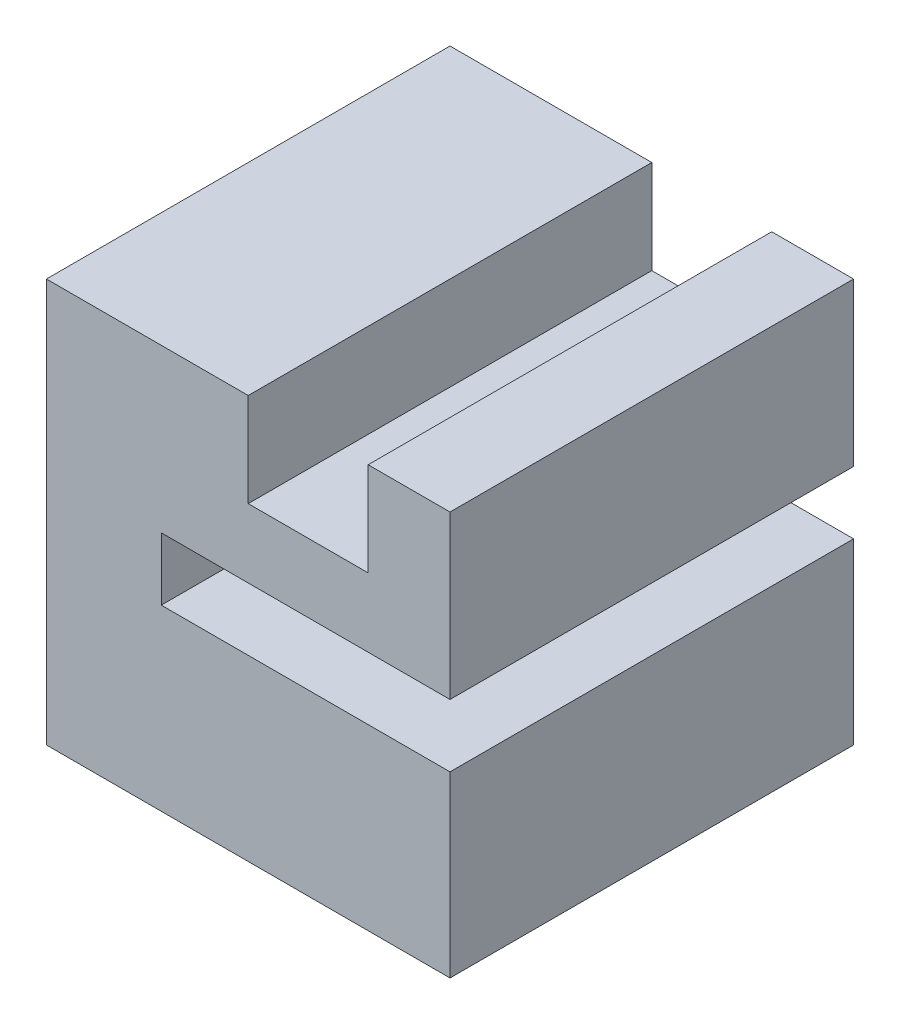
ISO-10303-21;
HEADER;
FILE_DESCRIPTION(('STEP AP214'),'2;1');
FILE_NAME('part.step','',(''),(''),'','','');
FILE_SCHEMA(('AUTOMOTIVE_DESIGN { 1 0 10303 214 1 1 1 1 }'));
ENDSEC;
DATA;
#1=APPLICATION_CONTEXT('core data for automotive mechanical design processes');
#2=APPLICATION_PROTOCOL_DEFINITION('international standard','automotive_design',2000,#1);
#3=PRODUCT_CONTEXT('',#1,'mechanical');
#4=PRODUCT('Part','Part','',(#3));
#5=PRODUCT_RELATED_PRODUCT_CATEGORY('part','',(#4));
#6=PRODUCT_DEFINITION_FORMATION('','',#4);
#7=PRODUCT_DEFINITION_CONTEXT('part definition',#1,'design');
#8=PRODUCT_DEFINITION('design','',#6,#7);
#9=PRODUCT_DEFINITION_SHAPE('','',#8);
#10=(LENGTH_UNIT() NAMED_UNIT(*) SI_UNIT(.MILLI.,.METRE.));
#11=(NAMED_UNIT(*) PLANE_ANGLE_UNIT() SI_UNIT($,.RADIAN.));
#12=(NAMED_UNIT(*) SI_UNIT($,.STERADIAN.) SOLID_ANGLE_UNIT());
#13=UNCERTAINTY_MEASURE_WITH_UNIT(LENGTH_MEASURE(1.E-05),#10,'distance_accuracy_value','');
#14=(GEOMETRIC_REPRESENTATION_CONTEXT(3) GLOBAL_UNCERTAINTY_ASSIGNED_CONTEXT((#13)) GLOBAL_UNIT_ASSIGNED_CONTEXT((#10,
#11,#12)) REPRESENTATION_CONTEXT('',''));
#15=CARTESIAN_POINT('',(0.,0.,0.));
#16=DIRECTION('',(0.,0.,1.));
#17=DIRECTION('',(1.,0.,0.));
#18=AXIS2_PLACEMENT_3D('',#15,#16,#17);
#19=CARTESIAN_POINT('',(40.,0.,40.));
#20=DIRECTION('',(-1.,0.,0.));
#21=DIRECTION('',(0.,0.,1.));
#22=AXIS2_PLACEMENT_3D('',#19,#20,#21);
#23=PLANE('',#22);
#24=DIRECTION('',(0.,1.,0.));
#25=VECTOR('',#24,1.);
#26=CARTESIAN_POINT('',(40.,0.,0.));
#27=LINE('',#26,#25);
#28=CARTESIAN_POINT('',(40.,0.,0.));
#29=VERTEX_POINT('',#28);
#30=CARTESIAN_POINT('',(40.,17.6959724518447,0.));
#31=VERTEX_POINT('',#30);
#32=EDGE_CURVE('E149',#29,#31,#27,.T.);
#33=ORIENTED_EDGE('',*,*,#32,.T.);
#34=DIRECTION('',(0.,0.,1.));
#35=VECTOR('',#34,1.);
#36=CARTESIAN_POINT('',(40.,17.6959724518447,40.));
#37=LINE('',#36,#35);
#38=CARTESIAN_POINT('',(40.,17.6959724518447,40.));
#39=VERTEX_POINT('',#38);
#40=EDGE_CURVE('E182',#31,#39,#37,.T.);
#41=ORIENTED_EDGE('',*,*,#40,.T.);
#42=DIRECTION('',(0.,1.,0.));
#43=VECTOR('',#42,1.);
#44=CARTESIAN_POINT('',(40.,0.,40.));
#45=LINE('',#44,#43);
#46=CARTESIAN_POINT('',(40.,0.,40.));
#47=VERTEX_POINT('',#46);
#48=EDGE_CURVE('E194',#47,#39,#45,.T.);
#49=ORIENTED_EDGE('',*,*,#48,.F.);
#50=DIRECTION('',(0.,0.,-1.));
#51=VECTOR('',#50,1.);
#52=CARTESIAN_POINT('',(40.,0.,40.));
#53=LINE('',#52,#51);
#54=EDGE_CURVE('E164',#47,#29,#53,.T.);
#55=ORIENTED_EDGE('',*,*,#54,.T.);
#56=EDGE_LOOP('',(#33,#41,#49,#55));
#57=FACE_BOUND('',#56,.T.);
#58=ADVANCED_FACE('F33',(#57),#23,.F.);
#59=CARTESIAN_POINT('',(0.,40.,40.));
#60=DIRECTION('',(0.,-1.,0.));
#61=DIRECTION('',(0.,0.,-1.));
#62=AXIS2_PLACEMENT_3D('',#59,#60,#61);
#63=PLANE('',#62);
#64=DIRECTION('',(-1.,0.,0.));
#65=VECTOR('',#64,1.);
#66=CARTESIAN_POINT('',(0.,40.,40.));
#67=LINE('',#66,#65);
#68=CARTESIAN_POINT('',(20.,40.,40.));
#69=VERTEX_POINT('',#68);
#70=CARTESIAN_POINT('',(0.,40.,40.));
#71=VERTEX_POINT('',#70);
#72=EDGE_CURVE('E193',#69,#71,#67,.T.);
#73=ORIENTED_EDGE('',*,*,#72,.F.);
#74=DIRECTION('',(0.,0.,-1.));
#75=VECTOR('',#74,1.);
#76=CARTESIAN_POINT('',(20.,40.,40.));
#77=LINE('',#76,#75);
#78=CARTESIAN_POINT('',(20.,40.,0.));
#79=VERTEX_POINT('',#78);
#80=EDGE_CURVE('E188',#69,#79,#77,.T.);
#81=ORIENTED_EDGE('',*,*,#80,.T.);
#82=DIRECTION('',(-1.,0.,0.));
#83=VECTOR('',#82,1.);
#84=CARTESIAN_POINT('',(0.,40.,0.));
#85=LINE('',#84,#83);
#86=CARTESIAN_POINT('',(0.,40.,0.));
#87=VERTEX_POINT('',#86);
#88=EDGE_CURVE('E142',#79,#87,#85,.T.);
#89=ORIENTED_EDGE('',*,*,#88,.T.);
#90=DIRECTION('',(0.,0.,-1.));
#91=VECTOR('',#90,1.);
#92=CARTESIAN_POINT('',(0.,40.,40.));
#93=LINE('',#92,#91);
#94=EDGE_CURVE('E158',#71,#87,#93,.T.);
#95=ORIENTED_EDGE('',*,*,#94,.F.);
#96=EDGE_LOOP('',(#73,#81,#89,#95));
#97=FACE_BOUND('',#96,.T.);
#98=ADVANCED_FACE('F246',(#97),#63,.F.);
#99=CARTESIAN_POINT('',(0.,0.,40.));
#100=DIRECTION('',(1.,0.,0.));
#101=DIRECTION('',(0.,0.,-1.));
#102=AXIS2_PLACEMENT_3D('',#99,#100,#101);
#103=PLANE('',#102);
#104=DIRECTION('',(0.,-1.,0.));
#105=VECTOR('',#104,1.);
#106=CARTESIAN_POINT('',(0.,0.,0.));
#107=LINE('',#106,#105);
#108=CARTESIAN_POINT('',(0.,0.,0.));
#109=VERTEX_POINT('',#108);
#110=EDGE_CURVE('E144',#87,#109,#107,.T.);
#111=ORIENTED_EDGE('',*,*,#110,.T.);
#112=DIRECTION('',(0.,0.,-1.));
#113=VECTOR('',#112,1.);
#114=CARTESIAN_POINT('',(0.,0.,40.));
#115=LINE('',#114,#113);
#116=CARTESIAN_POINT('',(0.,0.,40.));
#117=VERTEX_POINT('',#116);
#118=EDGE_CURVE('E167',#117,#109,#115,.T.);
#119=ORIENTED_EDGE('',*,*,#118,.F.);
#120=DIRECTION('',(0.,-1.,0.));
#121=VECTOR('',#120,1.);
#122=CARTESIAN_POINT('',(0.,0.,40.));
#123=LINE('',#122,#121);
#124=EDGE_CURVE('E152',#71,#117,#123,.T.);
#125=ORIENTED_EDGE('',*,*,#124,.F.);
#126=ORIENTED_EDGE('',*,*,#94,.T.);
#127=EDGE_LOOP('',(#111,#119,#125,#126));
#128=FACE_BOUND('',#127,.T.);
#129=ADVANCED_FACE('F35',(#128),#103,.F.);
#130=CARTESIAN_POINT('',(0.,0.,40.));
#131=DIRECTION('',(0.,1.,0.));
#132=DIRECTION('',(0.,0.,1.));
#133=AXIS2_PLACEMENT_3D('',#130,#131,#132);
#134=PLANE('',#133);
#135=DIRECTION('',(1.,0.,0.));
#136=VECTOR('',#135,1.);
#137=CARTESIAN_POINT('',(0.,0.,0.));
#138=LINE('',#137,#136);
#139=EDGE_CURVE('E185',#109,#29,#138,.T.);
#140=ORIENTED_EDGE('',*,*,#139,.T.);
#141=ORIENTED_EDGE('',*,*,#54,.F.);
#142=DIRECTION('',(1.,0.,0.));
#143=VECTOR('',#142,1.);
#144=CARTESIAN_POINT('',(0.,0.,40.));
#145=LINE('',#144,#143);
#146=EDGE_CURVE('E197',#117,#47,#145,.T.);
#147=ORIENTED_EDGE('',*,*,#146,.F.);
#148=ORIENTED_EDGE('',*,*,#118,.T.);
#149=EDGE_LOOP('',(#140,#141,#147,#148));
#150=FACE_BOUND('',#149,.T.);
#151=ADVANCED_FACE('F242',(#150),#134,.F.);
#152=CARTESIAN_POINT('',(40.,23.9068293207855,40.));
#153=VERTEX_POINT('',#152);
#154=CARTESIAN_POINT('',(40.,40.,40.));
#155=VERTEX_POINT('',#154);
#156=EDGE_CURVE('E181',#153,#155,#45,.T.);
#157=ORIENTED_EDGE('',*,*,#156,.F.);
#158=DIRECTION('',(0.,0.,-1.));
#159=VECTOR('',#158,1.);
#160=CARTESIAN_POINT('',(40.,23.9068293207855,40.));
#161=LINE('',#160,#159);
#162=CARTESIAN_POINT('',(40.,23.9068293207855,0.));
#163=VERTEX_POINT('',#162);
#164=EDGE_CURVE('E173',#153,#163,#161,.T.);
#165=ORIENTED_EDGE('',*,*,#164,.T.);
#166=CARTESIAN_POINT('',(40.,40.,0.));
#167=VERTEX_POINT('',#166);
#168=EDGE_CURVE('E154',#163,#167,#27,.T.);
#169=ORIENTED_EDGE('',*,*,#168,.T.);
#170=DIRECTION('',(0.,0.,-1.));
#171=VECTOR('',#170,1.);
#172=CARTESIAN_POINT('',(40.,40.,40.));
#173=LINE('',#172,#171);
#174=EDGE_CURVE('E160',#155,#167,#173,.T.);
#175=ORIENTED_EDGE('',*,*,#174,.F.);
#176=EDGE_LOOP('',(#157,#165,#169,#175));
#177=FACE_BOUND('',#176,.T.);
#178=ADVANCED_FACE('F179',(#177),#23,.F.);
#179=CARTESIAN_POINT('',(31.8874464803384,40.,0.));
#180=VERTEX_POINT('',#179);
#181=EDGE_CURVE('E148',#167,#180,#85,.T.);
#182=ORIENTED_EDGE('',*,*,#181,.T.);
#183=DIRECTION('',(0.,0.,1.));
#184=VECTOR('',#183,1.);
#185=CARTESIAN_POINT('',(31.8874464803384,40.,40.));
#186=LINE('',#185,#184);
#187=CARTESIAN_POINT('',(31.8874464803384,40.,40.));
#188=VERTEX_POINT('',#187);
#189=EDGE_CURVE('E202',#180,#188,#186,.T.);
#190=ORIENTED_EDGE('',*,*,#189,.T.);
#191=EDGE_CURVE('E161',#155,#188,#67,.T.);
#192=ORIENTED_EDGE('',*,*,#191,.F.);
#193=ORIENTED_EDGE('',*,*,#174,.T.);
#194=EDGE_LOOP('',(#182,#190,#192,#193));
#195=FACE_BOUND('',#194,.T.);
#196=ADVANCED_FACE('F227',(#195),#63,.F.);
#197=CARTESIAN_POINT('',(0.,0.,40.));
#198=DIRECTION('',(0.,0.,-1.));
#199=DIRECTION('',(-1.,0.,0.));
#200=AXIS2_PLACEMENT_3D('',#197,#198,#199);
#201=PLANE('',#200);
#202=DIRECTION('',(1.,0.,0.));
#203=VECTOR('',#202,1.);
#204=CARTESIAN_POINT('',(20.,30.7187368544625,40.));
#205=LINE('',#204,#203);
#206=CARTESIAN_POINT('',(20.,30.7187368544625,40.));
#207=VERTEX_POINT('',#206);
#208=CARTESIAN_POINT('',(31.8874464803384,30.7187368544625,40.));
#209=VERTEX_POINT('',#208);
#210=EDGE_CURVE('E223',#207,#209,#205,.T.);
#211=ORIENTED_EDGE('',*,*,#210,.F.);
#212=DIRECTION('',(0.,-1.,0.));
#213=VECTOR('',#212,1.);
#214=CARTESIAN_POINT('',(20.,44.4761187362024,40.));
#215=LINE('',#214,#213);
#216=EDGE_CURVE('E127',#69,#207,#215,.T.);
#217=ORIENTED_EDGE('',*,*,#216,.F.);
#218=ORIENTED_EDGE('',*,*,#72,.T.);
#219=ORIENTED_EDGE('',*,*,#124,.T.);
#220=ORIENTED_EDGE('',*,*,#146,.T.);
#221=ORIENTED_EDGE('',*,*,#48,.T.);
#222=DIRECTION('',(1.,0.,0.));
#223=VECTOR('',#222,1.);
#224=CARTESIAN_POINT('',(44.2423768110271,17.6959724518447,40.));
#225=LINE('',#224,#223);
#226=CARTESIAN_POINT('',(11.3849404721143,17.6959724518447,40.));
#227=VERTEX_POINT('',#226);
#228=EDGE_CURVE('E211',#227,#39,#225,.T.);
#229=ORIENTED_EDGE('',*,*,#228,.F.);
#230=DIRECTION('',(0.,-1.,0.));
#231=VECTOR('',#230,1.);
#232=CARTESIAN_POINT('',(11.3849404721143,23.9068293207855,40.));
#233=LINE('',#232,#231);
#234=CARTESIAN_POINT('',(11.3849404721143,23.9068293207855,40.));
#235=VERTEX_POINT('',#234);
#236=EDGE_CURVE('E213',#235,#227,#233,.T.);
#237=ORIENTED_EDGE('',*,*,#236,.F.);
#238=DIRECTION('',(-1.,0.,0.));
#239=VECTOR('',#238,1.);
#240=CARTESIAN_POINT('',(44.2423768110271,23.9068293207855,40.));
#241=LINE('',#240,#239);
#242=EDGE_CURVE('E216',#153,#235,#241,.T.);
#243=ORIENTED_EDGE('',*,*,#242,.F.);
#244=ORIENTED_EDGE('',*,*,#156,.T.);
#245=ORIENTED_EDGE('',*,*,#191,.T.);
#246=DIRECTION('',(0.,1.,0.));
#247=VECTOR('',#246,1.);
#248=CARTESIAN_POINT('',(31.8874464803384,44.4761187362024,40.));
#249=LINE('',#248,#247);
#250=EDGE_CURVE('E137',#209,#188,#249,.T.);
#251=ORIENTED_EDGE('',*,*,#250,.F.);
#252=EDGE_LOOP('',(#211,#217,#218,#219,#220,#221,#229,#237,#243,#244,#245,#251));
#253=FACE_BOUND('',#252,.T.);
#254=ADVANCED_FACE('F231',(#253),#201,.F.);
#255=CARTESIAN_POINT('',(0.,0.,0.));
#256=DIRECTION('',(0.,0.,-1.));
#257=DIRECTION('',(-1.,0.,0.));
#258=AXIS2_PLACEMENT_3D('',#255,#256,#257);
#259=PLANE('',#258);
#260=DIRECTION('',(0.,1.,0.));
#261=VECTOR('',#260,1.);
#262=CARTESIAN_POINT('',(20.,0.,0.));
#263=LINE('',#262,#261);
#264=CARTESIAN_POINT('',(20.,30.7187368544625,0.));
#265=VERTEX_POINT('',#264);
#266=EDGE_CURVE('E11',#265,#79,#263,.T.);
#267=ORIENTED_EDGE('',*,*,#266,.F.);
#268=DIRECTION('',(1.,0.,0.));
#269=VECTOR('',#268,1.);
#270=CARTESIAN_POINT('',(20.,30.7187368544625,0.));
#271=LINE('',#270,#269);
#272=CARTESIAN_POINT('',(31.8874464803384,30.7187368544625,0.));
#273=VERTEX_POINT('',#272);
#274=EDGE_CURVE('E134',#265,#273,#271,.T.);
#275=ORIENTED_EDGE('',*,*,#274,.T.);
#276=DIRECTION('',(0.,1.,0.));
#277=VECTOR('',#276,1.);
#278=CARTESIAN_POINT('',(31.8874464803384,44.4761187362024,0.));
#279=LINE('',#278,#277);
#280=EDGE_CURVE('E48',#273,#180,#279,.T.);
#281=ORIENTED_EDGE('',*,*,#280,.T.);
#282=ORIENTED_EDGE('',*,*,#181,.F.);
#283=ORIENTED_EDGE('',*,*,#168,.F.);
#284=DIRECTION('',(1.,0.,0.));
#285=VECTOR('',#284,1.);
#286=CARTESIAN_POINT('',(0.,23.9068293207855,0.));
#287=LINE('',#286,#285);
#288=CARTESIAN_POINT('',(11.3849404721143,23.9068293207855,0.));
#289=VERTEX_POINT('',#288);
#290=EDGE_CURVE('E41',#289,#163,#287,.T.);
#291=ORIENTED_EDGE('',*,*,#290,.F.);
#292=DIRECTION('',(0.,-1.,0.));
#293=VECTOR('',#292,1.);
#294=CARTESIAN_POINT('',(11.3849404721143,23.9068293207855,0.));
#295=LINE('',#294,#293);
#296=CARTESIAN_POINT('',(11.3849404721143,17.6959724518447,0.));
#297=VERTEX_POINT('',#296);
#298=EDGE_CURVE('E56',#289,#297,#295,.T.);
#299=ORIENTED_EDGE('',*,*,#298,.T.);
#300=DIRECTION('',(1.,0.,0.));
#301=VECTOR('',#300,1.);
#302=CARTESIAN_POINT('',(44.2423768110271,17.6959724518447,0.));
#303=LINE('',#302,#301);
#304=EDGE_CURVE('E209',#297,#31,#303,.T.);
#305=ORIENTED_EDGE('',*,*,#304,.T.);
#306=ORIENTED_EDGE('',*,*,#32,.F.);
#307=ORIENTED_EDGE('',*,*,#139,.F.);
#308=ORIENTED_EDGE('',*,*,#110,.F.);
#309=ORIENTED_EDGE('',*,*,#88,.F.);
#310=EDGE_LOOP('',(#267,#275,#281,#282,#283,#291,#299,#305,#306,#307,#308,#309));
#311=FACE_BOUND('',#310,.T.);
#312=ADVANCED_FACE('F140',(#311),#259,.T.);
#313=CARTESIAN_POINT('',(44.2423768110271,17.6959724518447,0.));
#314=DIRECTION('',(0.,-1.,0.));
#315=DIRECTION('',(0.,0.,-1.));
#316=AXIS2_PLACEMENT_3D('',#313,#314,#315);
#317=PLANE('',#316);
#318=ORIENTED_EDGE('',*,*,#304,.F.);
#319=DIRECTION('',(0.,0.,1.));
#320=VECTOR('',#319,1.);
#321=CARTESIAN_POINT('',(11.3849404721143,17.6959724518447,0.));
#322=LINE('',#321,#320);
#323=EDGE_CURVE('E208',#297,#227,#322,.T.);
#324=ORIENTED_EDGE('',*,*,#323,.T.);
#325=ORIENTED_EDGE('',*,*,#228,.T.);
#326=ORIENTED_EDGE('',*,*,#40,.F.);
#327=EDGE_LOOP('',(#318,#324,#325,#326));
#328=FACE_BOUND('',#327,.T.);
#329=ADVANCED_FACE('F238',(#328),#317,.F.);
#330=CARTESIAN_POINT('',(44.2423768110271,23.9068293207855,0.));
#331=DIRECTION('',(0.,1.,0.));
#332=DIRECTION('',(0.,0.,1.));
#333=AXIS2_PLACEMENT_3D('',#330,#331,#332);
#334=PLANE('',#333);
#335=ORIENTED_EDGE('',*,*,#242,.T.);
#336=DIRECTION('',(0.,0.,1.));
#337=VECTOR('',#336,1.);
#338=CARTESIAN_POINT('',(11.3849404721143,23.9068293207855,0.));
#339=LINE('',#338,#337);
#340=EDGE_CURVE('E175',#289,#235,#339,.T.);
#341=ORIENTED_EDGE('',*,*,#340,.F.);
#342=ORIENTED_EDGE('',*,*,#290,.T.);
#343=ORIENTED_EDGE('',*,*,#164,.F.);
#344=EDGE_LOOP('',(#335,#341,#342,#343));
#345=FACE_BOUND('',#344,.T.);
#346=ADVANCED_FACE('F172',(#345),#334,.F.);
#347=CARTESIAN_POINT('',(11.3849404721143,23.9068293207855,0.));
#348=DIRECTION('',(-1.,0.,0.));
#349=DIRECTION('',(0.,0.,1.));
#350=AXIS2_PLACEMENT_3D('',#347,#348,#349);
#351=PLANE('',#350);
#352=ORIENTED_EDGE('',*,*,#236,.T.);
#353=ORIENTED_EDGE('',*,*,#323,.F.);
#354=ORIENTED_EDGE('',*,*,#298,.F.);
#355=ORIENTED_EDGE('',*,*,#340,.T.);
#356=EDGE_LOOP('',(#352,#353,#354,#355));
#357=FACE_BOUND('',#356,.T.);
#358=ADVANCED_FACE('F234',(#357),#351,.F.);
#359=CARTESIAN_POINT('',(20.,44.4761187362024,0.));
#360=DIRECTION('',(-1.,0.,0.));
#361=DIRECTION('',(0.,0.,1.));
#362=AXIS2_PLACEMENT_3D('',#359,#360,#361);
#363=PLANE('',#362);
#364=ORIENTED_EDGE('',*,*,#216,.T.);
#365=DIRECTION('',(0.,0.,1.));
#366=VECTOR('',#365,1.);
#367=CARTESIAN_POINT('',(20.,30.7187368544625,0.));
#368=LINE('',#367,#366);
#369=EDGE_CURVE('E121',#265,#207,#368,.T.);
#370=ORIENTED_EDGE('',*,*,#369,.F.);
#371=ORIENTED_EDGE('',*,*,#266,.T.);
#372=ORIENTED_EDGE('',*,*,#80,.F.);
#373=EDGE_LOOP('',(#364,#370,#371,#372));
#374=FACE_BOUND('',#373,.T.);
#375=ADVANCED_FACE('F123',(#374),#363,.F.);
#376=CARTESIAN_POINT('',(31.8874464803384,44.4761187362024,0.));
#377=DIRECTION('',(1.,0.,0.));
#378=DIRECTION('',(0.,0.,-1.));
#379=AXIS2_PLACEMENT_3D('',#376,#377,#378);
#380=PLANE('',#379);
#381=ORIENTED_EDGE('',*,*,#280,.F.);
#382=DIRECTION('',(0.,0.,1.));
#383=VECTOR('',#382,1.);
#384=CARTESIAN_POINT('',(31.8874464803384,30.7187368544625,0.));
#385=LINE('',#384,#383);
#386=EDGE_CURVE('E131',#273,#209,#385,.T.);
#387=ORIENTED_EDGE('',*,*,#386,.T.);
#388=ORIENTED_EDGE('',*,*,#250,.T.);
#389=ORIENTED_EDGE('',*,*,#189,.F.);
#390=EDGE_LOOP('',(#381,#387,#388,#389));
#391=FACE_BOUND('',#390,.T.);
#392=ADVANCED_FACE('F331',(#391),#380,.F.);
#393=CARTESIAN_POINT('',(20.,30.7187368544625,0.));
#394=DIRECTION('',(0.,-1.,0.));
#395=DIRECTION('',(0.,0.,-1.));
#396=AXIS2_PLACEMENT_3D('',#393,#394,#395);
#397=PLANE('',#396);
#398=ORIENTED_EDGE('',*,*,#210,.T.);
#399=ORIENTED_EDGE('',*,*,#386,.F.);
#400=ORIENTED_EDGE('',*,*,#274,.F.);
#401=ORIENTED_EDGE('',*,*,#369,.T.);
#402=EDGE_LOOP('',(#398,#399,#400,#401));
#403=FACE_BOUND('',#402,.T.);
#404=ADVANCED_FACE('F135',(#403),#397,.F.);
#405=CLOSED_SHELL('',(#58,#98,#129,#151,#178,#196,#254,#312,#329,#346,#358,#375,#392,#404));
#406=MANIFOLD_SOLID_BREP('B2',#405);
#407=ADVANCED_BREP_SHAPE_REPRESENTATION('',(#18,#406),#14);
#408=SHAPE_DEFINITION_REPRESENTATION(#9,#407);
ENDSEC;
END-ISO-10303-21;
